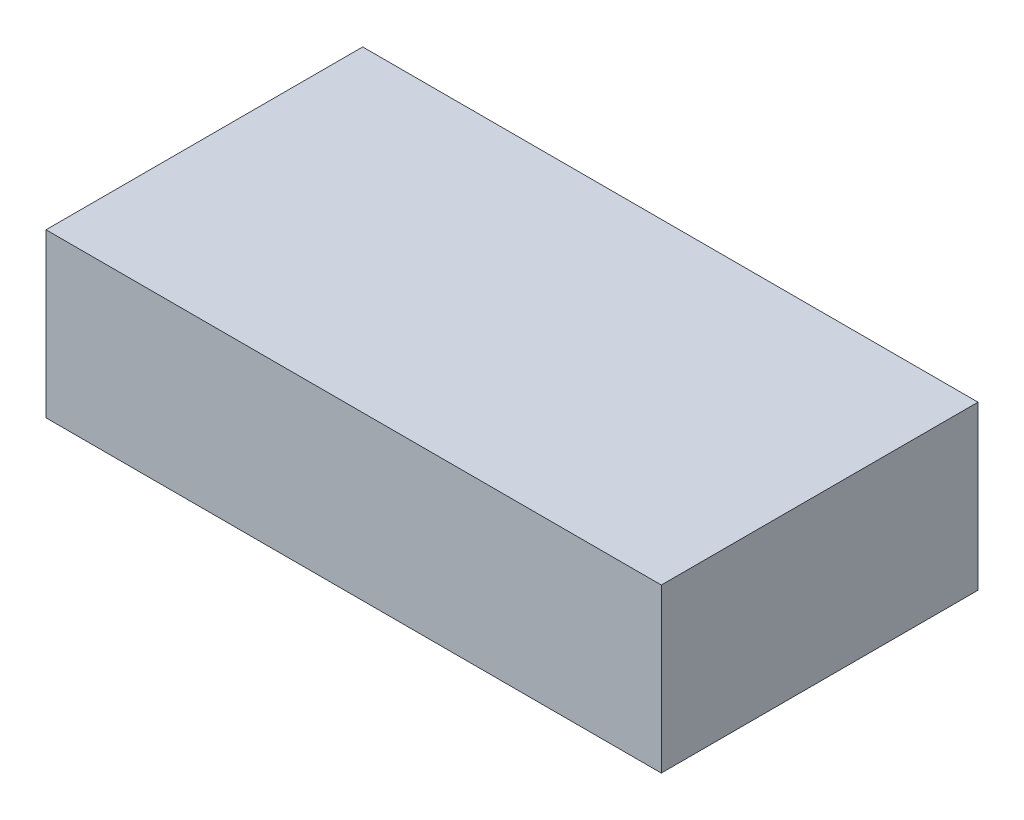
ISO-10303-21;
HEADER;
FILE_DESCRIPTION(('STEP AP214'),'2;1');
FILE_NAME('part.step','',(''),(''),'','','');
FILE_SCHEMA(('AUTOMOTIVE_DESIGN { 1 0 10303 214 1 1 1 1 }'));
ENDSEC;
DATA;
#1=APPLICATION_CONTEXT('core data for automotive mechanical design processes');
#2=APPLICATION_PROTOCOL_DEFINITION('international standard','automotive_design',2000,#1);
#3=PRODUCT_CONTEXT('',#1,'mechanical');
#4=PRODUCT('Part','Part','',(#3));
#5=PRODUCT_RELATED_PRODUCT_CATEGORY('part','',(#4));
#6=PRODUCT_DEFINITION_FORMATION('','',#4);
#7=PRODUCT_DEFINITION_CONTEXT('part definition',#1,'design');
#8=PRODUCT_DEFINITION('design','',#6,#7);
#9=PRODUCT_DEFINITION_SHAPE('','',#8);
#10=(LENGTH_UNIT() NAMED_UNIT(*) SI_UNIT(.MILLI.,.METRE.));
#11=(NAMED_UNIT(*) PLANE_ANGLE_UNIT() SI_UNIT($,.RADIAN.));
#12=(NAMED_UNIT(*) SI_UNIT($,.STERADIAN.) SOLID_ANGLE_UNIT());
#13=UNCERTAINTY_MEASURE_WITH_UNIT(LENGTH_MEASURE(1.E-05),#10,'distance_accuracy_value','');
#14=(GEOMETRIC_REPRESENTATION_CONTEXT(3) GLOBAL_UNCERTAINTY_ASSIGNED_CONTEXT((#13)) GLOBAL_UNIT_ASSIGNED_CONTEXT((#10,
#11,#12)) REPRESENTATION_CONTEXT('',''));
#15=CARTESIAN_POINT('',(0.,0.,0.));
#16=DIRECTION('',(0.,0.,1.));
#17=DIRECTION('',(1.,0.,0.));
#18=AXIS2_PLACEMENT_3D('',#15,#16,#17);
#19=CARTESIAN_POINT('',(-34.,18.,-17.5));
#20=DIRECTION('',(1.,0.,0.));
#21=DIRECTION('',(0.,0.,-1.));
#22=AXIS2_PLACEMENT_3D('',#19,#20,#21);
#23=PLANE('',#22);
#24=DIRECTION('',(0.,0.,1.));
#25=VECTOR('',#24,1.);
#26=CARTESIAN_POINT('',(-34.,0.,-17.5));
#27=LINE('',#26,#25);
#28=CARTESIAN_POINT('',(-34.,0.,-17.5));
#29=VERTEX_POINT('',#28);
#30=CARTESIAN_POINT('',(-34.,0.,17.5));
#31=VERTEX_POINT('',#30);
#32=EDGE_CURVE('E111',#29,#31,#27,.T.);
#33=ORIENTED_EDGE('',*,*,#32,.T.);
#34=DIRECTION('',(0.,-1.,0.));
#35=VECTOR('',#34,1.);
#36=CARTESIAN_POINT('',(-34.,18.,17.5));
#37=LINE('',#36,#35);
#38=CARTESIAN_POINT('',(-34.,18.,17.5));
#39=VERTEX_POINT('',#38);
#40=EDGE_CURVE('E11',#39,#31,#37,.T.);
#41=ORIENTED_EDGE('',*,*,#40,.F.);
#42=DIRECTION('',(0.,0.,1.));
#43=VECTOR('',#42,1.);
#44=CARTESIAN_POINT('',(-34.,18.,-17.5));
#45=LINE('',#44,#43);
#46=CARTESIAN_POINT('',(-34.,18.,-17.5));
#47=VERTEX_POINT('',#46);
#48=EDGE_CURVE('E95',#47,#39,#45,.T.);
#49=ORIENTED_EDGE('',*,*,#48,.F.);
#50=DIRECTION('',(0.,-1.,0.));
#51=VECTOR('',#50,1.);
#52=CARTESIAN_POINT('',(-34.,18.,-17.5));
#53=LINE('',#52,#51);
#54=EDGE_CURVE('E107',#47,#29,#53,.T.);
#55=ORIENTED_EDGE('',*,*,#54,.T.);
#56=EDGE_LOOP('',(#33,#41,#49,#55));
#57=FACE_BOUND('',#56,.T.);
#58=ADVANCED_FACE('F43',(#57),#23,.F.);
#59=CARTESIAN_POINT('',(-34.,18.,17.5));
#60=DIRECTION('',(0.,0.,-1.));
#61=DIRECTION('',(-1.,0.,0.));
#62=AXIS2_PLACEMENT_3D('',#59,#60,#61);
#63=PLANE('',#62);
#64=DIRECTION('',(1.,0.,0.));
#65=VECTOR('',#64,1.);
#66=CARTESIAN_POINT('',(-34.,0.,17.5));
#67=LINE('',#66,#65);
#68=CARTESIAN_POINT('',(34.,0.,17.5));
#69=VERTEX_POINT('',#68);
#70=EDGE_CURVE('E100',#31,#69,#67,.T.);
#71=ORIENTED_EDGE('',*,*,#70,.T.);
#72=DIRECTION('',(0.,-1.,0.));
#73=VECTOR('',#72,1.);
#74=CARTESIAN_POINT('',(34.,18.,17.5));
#75=LINE('',#74,#73);
#76=CARTESIAN_POINT('',(34.,18.,17.5));
#77=VERTEX_POINT('',#76);
#78=EDGE_CURVE('E52',#77,#69,#75,.T.);
#79=ORIENTED_EDGE('',*,*,#78,.F.);
#80=DIRECTION('',(1.,0.,0.));
#81=VECTOR('',#80,1.);
#82=CARTESIAN_POINT('',(-34.,18.,17.5));
#83=LINE('',#82,#81);
#84=EDGE_CURVE('E90',#39,#77,#83,.T.);
#85=ORIENTED_EDGE('',*,*,#84,.F.);
#86=ORIENTED_EDGE('',*,*,#40,.T.);
#87=EDGE_LOOP('',(#71,#79,#85,#86));
#88=FACE_BOUND('',#87,.T.);
#89=ADVANCED_FACE('F99',(#88),#63,.F.);
#90=CARTESIAN_POINT('',(34.,18.,-17.5));
#91=DIRECTION('',(-1.,0.,0.));
#92=DIRECTION('',(0.,0.,1.));
#93=AXIS2_PLACEMENT_3D('',#90,#91,#92);
#94=PLANE('',#93);
#95=DIRECTION('',(0.,0.,-1.));
#96=VECTOR('',#95,1.);
#97=CARTESIAN_POINT('',(34.,0.,-17.5));
#98=LINE('',#97,#96);
#99=CARTESIAN_POINT('',(34.,0.,-17.5));
#100=VERTEX_POINT('',#99);
#101=EDGE_CURVE('E77',#69,#100,#98,.T.);
#102=ORIENTED_EDGE('',*,*,#101,.T.);
#103=DIRECTION('',(0.,-1.,0.));
#104=VECTOR('',#103,1.);
#105=CARTESIAN_POINT('',(34.,18.,-17.5));
#106=LINE('',#105,#104);
#107=CARTESIAN_POINT('',(34.,18.,-17.5));
#108=VERTEX_POINT('',#107);
#109=EDGE_CURVE('E102',#108,#100,#106,.T.);
#110=ORIENTED_EDGE('',*,*,#109,.F.);
#111=DIRECTION('',(0.,0.,-1.));
#112=VECTOR('',#111,1.);
#113=CARTESIAN_POINT('',(34.,18.,-17.5));
#114=LINE('',#113,#112);
#115=EDGE_CURVE('E93',#77,#108,#114,.T.);
#116=ORIENTED_EDGE('',*,*,#115,.F.);
#117=ORIENTED_EDGE('',*,*,#78,.T.);
#118=EDGE_LOOP('',(#102,#110,#116,#117));
#119=FACE_BOUND('',#118,.T.);
#120=ADVANCED_FACE('F103',(#119),#94,.F.);
#121=CARTESIAN_POINT('',(-34.,18.,-17.5));
#122=DIRECTION('',(0.,0.,1.));
#123=DIRECTION('',(1.,0.,0.));
#124=AXIS2_PLACEMENT_3D('',#121,#122,#123);
#125=PLANE('',#124);
#126=DIRECTION('',(-1.,0.,0.));
#127=VECTOR('',#126,1.);
#128=CARTESIAN_POINT('',(-34.,0.,-17.5));
#129=LINE('',#128,#127);
#130=EDGE_CURVE('E83',#100,#29,#129,.T.);
#131=ORIENTED_EDGE('',*,*,#130,.T.);
#132=ORIENTED_EDGE('',*,*,#54,.F.);
#133=DIRECTION('',(-1.,0.,0.));
#134=VECTOR('',#133,1.);
#135=CARTESIAN_POINT('',(-34.,18.,-17.5));
#136=LINE('',#135,#134);
#137=EDGE_CURVE('E60',#108,#47,#136,.T.);
#138=ORIENTED_EDGE('',*,*,#137,.F.);
#139=ORIENTED_EDGE('',*,*,#109,.T.);
#140=EDGE_LOOP('',(#131,#132,#138,#139));
#141=FACE_BOUND('',#140,.T.);
#142=ADVANCED_FACE('F124',(#141),#125,.F.);
#143=CARTESIAN_POINT('',(0.,18.,0.));
#144=DIRECTION('',(0.,1.,0.));
#145=DIRECTION('',(0.,0.,1.));
#146=AXIS2_PLACEMENT_3D('',#143,#144,#145);
#147=PLANE('',#146);
#148=ORIENTED_EDGE('',*,*,#48,.T.);
#149=ORIENTED_EDGE('',*,*,#84,.T.);
#150=ORIENTED_EDGE('',*,*,#115,.T.);
#151=ORIENTED_EDGE('',*,*,#137,.T.);
#152=EDGE_LOOP('',(#148,#149,#150,#151));
#153=FACE_BOUND('',#152,.T.);
#154=ADVANCED_FACE('F91',(#153),#147,.T.);
#155=CARTESIAN_POINT('',(0.,0.,0.));
#156=DIRECTION('',(0.,1.,0.));
#157=DIRECTION('',(0.,0.,1.));
#158=AXIS2_PLACEMENT_3D('',#155,#156,#157);
#159=PLANE('',#158);
#160=ORIENTED_EDGE('',*,*,#32,.F.);
#161=ORIENTED_EDGE('',*,*,#130,.F.);
#162=ORIENTED_EDGE('',*,*,#101,.F.);
#163=ORIENTED_EDGE('',*,*,#70,.F.);
#164=EDGE_LOOP('',(#160,#161,#162,#163));
#165=FACE_BOUND('',#164,.T.);
#166=ADVANCED_FACE('F127',(#165),#159,.F.);
#167=CLOSED_SHELL('',(#58,#89,#120,#142,#154,#166));
#168=MANIFOLD_SOLID_BREP('B2',#167);
#169=ADVANCED_BREP_SHAPE_REPRESENTATION('',(#18,#168),#14);
#170=SHAPE_DEFINITION_REPRESENTATION(#9,#169);
ENDSEC;
END-ISO-10303-21;
